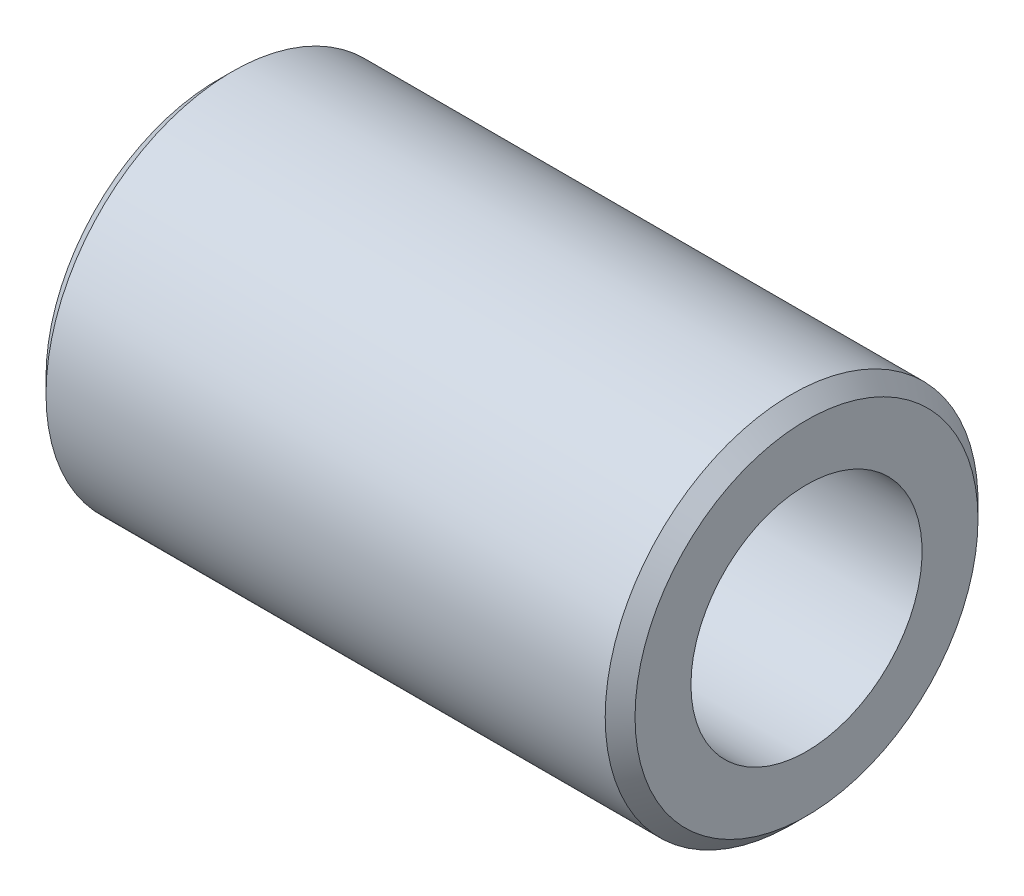
ISO-10303-21;
HEADER;
FILE_DESCRIPTION(('STEP AP214'),'2;1');
FILE_NAME('part.step','',(''),(''),'','','');
FILE_SCHEMA(('AUTOMOTIVE_DESIGN { 1 0 10303 214 1 1 1 1 }'));
ENDSEC;
DATA;
#1=APPLICATION_CONTEXT('core data for automotive mechanical design processes');
#2=APPLICATION_PROTOCOL_DEFINITION('international standard','automotive_design',2000,#1);
#3=PRODUCT_CONTEXT('',#1,'mechanical');
#4=PRODUCT('Part','Part','',(#3));
#5=PRODUCT_RELATED_PRODUCT_CATEGORY('part','',(#4));
#6=PRODUCT_DEFINITION_FORMATION('','',#4);
#7=PRODUCT_DEFINITION_CONTEXT('part definition',#1,'design');
#8=PRODUCT_DEFINITION('design','',#6,#7);
#9=PRODUCT_DEFINITION_SHAPE('','',#8);
#10=(LENGTH_UNIT() NAMED_UNIT(*) SI_UNIT(.MILLI.,.METRE.));
#11=(NAMED_UNIT(*) PLANE_ANGLE_UNIT() SI_UNIT($,.RADIAN.));
#12=(NAMED_UNIT(*) SI_UNIT($,.STERADIAN.) SOLID_ANGLE_UNIT());
#13=UNCERTAINTY_MEASURE_WITH_UNIT(LENGTH_MEASURE(1.E-05),#10,'distance_accuracy_value','');
#14=(GEOMETRIC_REPRESENTATION_CONTEXT(3) GLOBAL_UNCERTAINTY_ASSIGNED_CONTEXT((#13)) GLOBAL_UNIT_ASSIGNED_CONTEXT((#10,
#11,#12)) REPRESENTATION_CONTEXT('',''));
#15=CARTESIAN_POINT('',(0.,0.,0.));
#16=DIRECTION('',(0.,0.,1.));
#17=DIRECTION('',(1.,0.,0.));
#18=AXIS2_PLACEMENT_3D('',#15,#16,#17);
#19=CARTESIAN_POINT('',(-39.5,15.5,0.));
#20=DIRECTION('',(1.,0.,0.));
#21=DIRECTION('',(0.,0.,-1.));
#22=AXIS2_PLACEMENT_3D('',#19,#20,#21);
#23=PLANE('',#22);
#24=CARTESIAN_POINT('',(-39.5,0.,0.));
#25=DIRECTION('',(-1.,0.,0.));
#26=DIRECTION('',(0.,0.,1.));
#27=AXIS2_PLACEMENT_3D('',#24,#25,#26);
#28=CIRCLE('',#27,15.5);
#29=CARTESIAN_POINT('',(-39.5,0.,15.5));
#30=VERTEX_POINT('',#29);
#31=EDGE_CURVE('E59',#30,#30,#28,.T.);
#32=ORIENTED_EDGE('',*,*,#31,.F.);
#33=EDGE_LOOP('',(#32));
#34=FACE_BOUND('',#33,.T.);
#35=CARTESIAN_POINT('',(-39.5,0.,0.));
#36=DIRECTION('',(-1.,0.,0.));
#37=DIRECTION('',(0.,0.,1.));
#38=AXIS2_PLACEMENT_3D('',#35,#36,#37);
#39=CIRCLE('',#38,23.);
#40=CARTESIAN_POINT('',(-39.5,0.,23.));
#41=VERTEX_POINT('',#40);
#42=EDGE_CURVE('E10',#41,#41,#39,.T.);
#43=ORIENTED_EDGE('',*,*,#42,.T.);
#44=EDGE_LOOP('',(#43));
#45=FACE_BOUND('',#44,.T.);
#46=ADVANCED_FACE('F37',(#34,#45),#23,.F.);
#47=CARTESIAN_POINT('',(-37.5,0.,0.));
#48=DIRECTION('',(1.,0.,0.));
#49=DIRECTION('',(0.,0.,-1.));
#50=AXIS2_PLACEMENT_3D('',#47,#48,#49);
#51=CONICAL_SURFACE('',#50,25.,0.785398163397448);
#52=ORIENTED_EDGE('',*,*,#42,.F.);
#53=EDGE_LOOP('',(#52));
#54=FACE_BOUND('',#53,.T.);
#55=CARTESIAN_POINT('',(-37.5,0.,0.));
#56=DIRECTION('',(-1.,0.,0.));
#57=DIRECTION('',(0.,0.,1.));
#58=AXIS2_PLACEMENT_3D('',#55,#56,#57);
#59=CIRCLE('',#58,25.);
#60=CARTESIAN_POINT('',(-37.5,0.,25.));
#61=VERTEX_POINT('',#60);
#62=EDGE_CURVE('E43',#61,#61,#59,.T.);
#63=ORIENTED_EDGE('',*,*,#62,.T.);
#64=EDGE_LOOP('',(#63));
#65=FACE_BOUND('',#64,.T.);
#66=ADVANCED_FACE('F66',(#54,#65),#51,.T.);
#67=CARTESIAN_POINT('',(-39.5,0.,0.));
#68=DIRECTION('',(-1.,0.,0.));
#69=DIRECTION('',(0.,0.,1.));
#70=AXIS2_PLACEMENT_3D('',#67,#68,#69);
#71=CYLINDRICAL_SURFACE('',#70,25.);
#72=ORIENTED_EDGE('',*,*,#62,.F.);
#73=EDGE_LOOP('',(#72));
#74=FACE_BOUND('',#73,.T.);
#75=CARTESIAN_POINT('',(37.5,0.,0.));
#76=DIRECTION('',(-1.,0.,0.));
#77=DIRECTION('',(0.,0.,1.));
#78=AXIS2_PLACEMENT_3D('',#75,#76,#77);
#79=CIRCLE('',#78,25.);
#80=CARTESIAN_POINT('',(37.5,0.,25.));
#81=VERTEX_POINT('',#80);
#82=EDGE_CURVE('E47',#81,#81,#79,.T.);
#83=ORIENTED_EDGE('',*,*,#82,.T.);
#84=EDGE_LOOP('',(#83));
#85=FACE_BOUND('',#84,.T.);
#86=ADVANCED_FACE('F70',(#74,#85),#71,.T.);
#87=CARTESIAN_POINT('',(39.5,0.,0.));
#88=DIRECTION('',(-1.,0.,0.));
#89=DIRECTION('',(0.,0.,1.));
#90=AXIS2_PLACEMENT_3D('',#87,#88,#89);
#91=CONICAL_SURFACE('',#90,23.,0.785398163397448);
#92=ORIENTED_EDGE('',*,*,#82,.F.);
#93=EDGE_LOOP('',(#92));
#94=FACE_BOUND('',#93,.T.);
#95=CARTESIAN_POINT('',(39.5,0.,0.));
#96=DIRECTION('',(-1.,0.,0.));
#97=DIRECTION('',(0.,0.,1.));
#98=AXIS2_PLACEMENT_3D('',#95,#96,#97);
#99=CIRCLE('',#98,23.);
#100=CARTESIAN_POINT('',(39.5,0.,23.));
#101=VERTEX_POINT('',#100);
#102=EDGE_CURVE('E51',#101,#101,#99,.T.);
#103=ORIENTED_EDGE('',*,*,#102,.T.);
#104=EDGE_LOOP('',(#103));
#105=FACE_BOUND('',#104,.T.);
#106=ADVANCED_FACE('F75',(#94,#105),#91,.T.);
#107=CARTESIAN_POINT('',(39.5,15.5,0.));
#108=DIRECTION('',(-1.,0.,0.));
#109=DIRECTION('',(0.,0.,1.));
#110=AXIS2_PLACEMENT_3D('',#107,#108,#109);
#111=PLANE('',#110);
#112=ORIENTED_EDGE('',*,*,#102,.F.);
#113=EDGE_LOOP('',(#112));
#114=FACE_BOUND('',#113,.T.);
#115=CARTESIAN_POINT('',(39.5,0.,0.));
#116=DIRECTION('',(-1.,0.,0.));
#117=DIRECTION('',(0.,0.,1.));
#118=AXIS2_PLACEMENT_3D('',#115,#116,#117);
#119=CIRCLE('',#118,15.5);
#120=CARTESIAN_POINT('',(39.5,0.,15.5));
#121=VERTEX_POINT('',#120);
#122=EDGE_CURVE('E56',#121,#121,#119,.T.);
#123=ORIENTED_EDGE('',*,*,#122,.T.);
#124=EDGE_LOOP('',(#123));
#125=FACE_BOUND('',#124,.T.);
#126=ADVANCED_FACE('F81',(#114,#125),#111,.F.);
#127=CARTESIAN_POINT('',(-39.5,0.,0.));
#128=DIRECTION('',(-1.,0.,0.));
#129=DIRECTION('',(0.,0.,1.));
#130=AXIS2_PLACEMENT_3D('',#127,#128,#129);
#131=CYLINDRICAL_SURFACE('',#130,15.5);
#132=ORIENTED_EDGE('',*,*,#122,.F.);
#133=EDGE_LOOP('',(#132));
#134=FACE_BOUND('',#133,.T.);
#135=ORIENTED_EDGE('',*,*,#31,.T.);
#136=EDGE_LOOP('',(#135));
#137=FACE_BOUND('',#136,.T.);
#138=ADVANCED_FACE('F63',(#134,#137),#131,.F.);
#139=CLOSED_SHELL('',(#46,#66,#86,#106,#126,#138));
#140=MANIFOLD_SOLID_BREP('B2',#139);
#141=ADVANCED_BREP_SHAPE_REPRESENTATION('',(#18,#140),#14);
#142=SHAPE_DEFINITION_REPRESENTATION(#9,#141);
ENDSEC;
END-ISO-10303-21;
